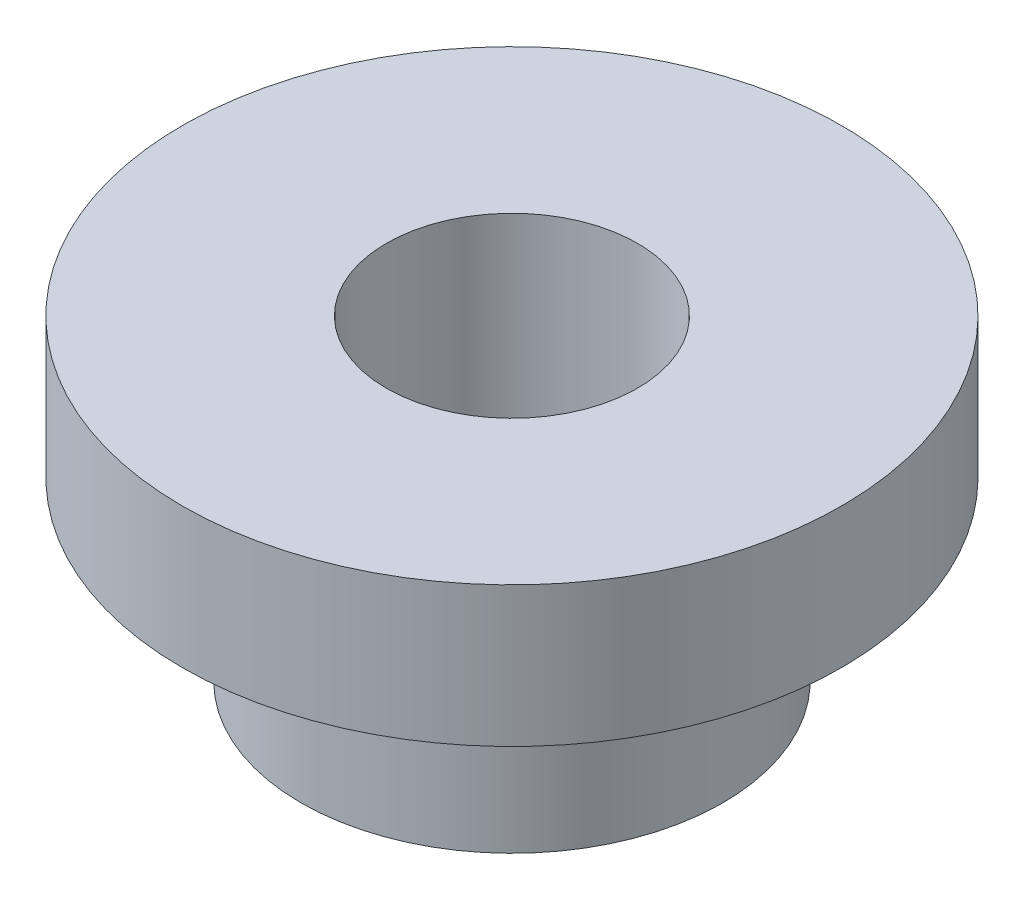
ISO-10303-21;
HEADER;
FILE_DESCRIPTION(('STEP AP214'),'2;1');
FILE_NAME('part.step','',(''),(''),'','','');
FILE_SCHEMA(('AUTOMOTIVE_DESIGN { 1 0 10303 214 1 1 1 1 }'));
ENDSEC;
DATA;
#1=APPLICATION_CONTEXT('core data for automotive mechanical design processes');
#2=APPLICATION_PROTOCOL_DEFINITION('international standard','automotive_design',2000,#1);
#3=PRODUCT_CONTEXT('',#1,'mechanical');
#4=PRODUCT('Part','Part','',(#3));
#5=PRODUCT_RELATED_PRODUCT_CATEGORY('part','',(#4));
#6=PRODUCT_DEFINITION_FORMATION('','',#4);
#7=PRODUCT_DEFINITION_CONTEXT('part definition',#1,'design');
#8=PRODUCT_DEFINITION('design','',#6,#7);
#9=PRODUCT_DEFINITION_SHAPE('','',#8);
#10=(LENGTH_UNIT() NAMED_UNIT(*) SI_UNIT(.MILLI.,.METRE.));
#11=(NAMED_UNIT(*) PLANE_ANGLE_UNIT() SI_UNIT($,.RADIAN.));
#12=(NAMED_UNIT(*) SI_UNIT($,.STERADIAN.) SOLID_ANGLE_UNIT());
#13=UNCERTAINTY_MEASURE_WITH_UNIT(LENGTH_MEASURE(1.E-05),#10,'distance_accuracy_value','');
#14=(GEOMETRIC_REPRESENTATION_CONTEXT(3) GLOBAL_UNCERTAINTY_ASSIGNED_CONTEXT((#13)) GLOBAL_UNIT_ASSIGNED_CONTEXT((#10,
#11,#12)) REPRESENTATION_CONTEXT('',''));
#15=CARTESIAN_POINT('',(0.,0.,0.));
#16=DIRECTION('',(0.,0.,1.));
#17=DIRECTION('',(1.,0.,0.));
#18=AXIS2_PLACEMENT_3D('',#15,#16,#17);
#19=CARTESIAN_POINT('',(8.,-6.,0.));
#20=DIRECTION('',(0.,1.,0.));
#21=DIRECTION('',(0.,0.,1.));
#22=AXIS2_PLACEMENT_3D('',#19,#20,#21);
#23=PLANE('',#22);
#24=CARTESIAN_POINT('',(0.,-6.,0.));
#25=DIRECTION('',(0.,1.,0.));
#26=DIRECTION('',(0.,0.,1.));
#27=AXIS2_PLACEMENT_3D('',#24,#25,#26);
#28=CIRCLE('',#27,8.);
#29=CARTESIAN_POINT('',(0.,-6.,8.));
#30=VERTEX_POINT('',#29);
#31=EDGE_CURVE('E59',#30,#30,#28,.T.);
#32=ORIENTED_EDGE('',*,*,#31,.F.);
#33=EDGE_LOOP('',(#32));
#34=FACE_BOUND('',#33,.T.);
#35=CARTESIAN_POINT('',(0.,-6.,0.));
#36=DIRECTION('',(0.,1.,0.));
#37=DIRECTION('',(0.,0.,1.));
#38=AXIS2_PLACEMENT_3D('',#35,#36,#37);
#39=CIRCLE('',#38,4.7625);
#40=CARTESIAN_POINT('',(0.,-6.,4.7625));
#41=VERTEX_POINT('',#40);
#42=EDGE_CURVE('E10',#41,#41,#39,.T.);
#43=ORIENTED_EDGE('',*,*,#42,.T.);
#44=EDGE_LOOP('',(#43));
#45=FACE_BOUND('',#44,.T.);
#46=ADVANCED_FACE('F37',(#34,#45),#23,.F.);
#47=CARTESIAN_POINT('',(0.,6.,0.));
#48=DIRECTION('',(0.,1.,0.));
#49=DIRECTION('',(0.,0.,1.));
#50=AXIS2_PLACEMENT_3D('',#47,#48,#49);
#51=CYLINDRICAL_SURFACE('',#50,4.7625);
#52=ORIENTED_EDGE('',*,*,#42,.F.);
#53=EDGE_LOOP('',(#52));
#54=FACE_BOUND('',#53,.T.);
#55=CARTESIAN_POINT('',(0.,6.,0.));
#56=DIRECTION('',(0.,1.,0.));
#57=DIRECTION('',(0.,0.,1.));
#58=AXIS2_PLACEMENT_3D('',#55,#56,#57);
#59=CIRCLE('',#58,4.7625);
#60=CARTESIAN_POINT('',(0.,6.,4.7625));
#61=VERTEX_POINT('',#60);
#62=EDGE_CURVE('E43',#61,#61,#59,.T.);
#63=ORIENTED_EDGE('',*,*,#62,.T.);
#64=EDGE_LOOP('',(#63));
#65=FACE_BOUND('',#64,.T.);
#66=ADVANCED_FACE('F66',(#54,#65),#51,.F.);
#67=CARTESIAN_POINT('',(4.7625,6.,0.));
#68=DIRECTION('',(0.,-1.,0.));
#69=DIRECTION('',(0.,0.,-1.));
#70=AXIS2_PLACEMENT_3D('',#67,#68,#69);
#71=PLANE('',#70);
#72=ORIENTED_EDGE('',*,*,#62,.F.);
#73=EDGE_LOOP('',(#72));
#74=FACE_BOUND('',#73,.T.);
#75=CARTESIAN_POINT('',(0.,6.,0.));
#76=DIRECTION('',(0.,1.,0.));
#77=DIRECTION('',(0.,0.,1.));
#78=AXIS2_PLACEMENT_3D('',#75,#76,#77);
#79=CIRCLE('',#78,12.5);
#80=CARTESIAN_POINT('',(0.,6.,12.5));
#81=VERTEX_POINT('',#80);
#82=EDGE_CURVE('E47',#81,#81,#79,.T.);
#83=ORIENTED_EDGE('',*,*,#82,.T.);
#84=EDGE_LOOP('',(#83));
#85=FACE_BOUND('',#84,.T.);
#86=ADVANCED_FACE('F70',(#74,#85),#71,.F.);
#87=CARTESIAN_POINT('',(0.,6.,0.));
#88=DIRECTION('',(0.,1.,0.));
#89=DIRECTION('',(0.,0.,1.));
#90=AXIS2_PLACEMENT_3D('',#87,#88,#89);
#91=CYLINDRICAL_SURFACE('',#90,12.5);
#92=ORIENTED_EDGE('',*,*,#82,.F.);
#93=EDGE_LOOP('',(#92));
#94=FACE_BOUND('',#93,.T.);
#95=CARTESIAN_POINT('',(0.,0.690000000000001,0.));
#96=DIRECTION('',(0.,1.,0.));
#97=DIRECTION('',(0.,0.,1.));
#98=AXIS2_PLACEMENT_3D('',#95,#96,#97);
#99=CIRCLE('',#98,12.5);
#100=CARTESIAN_POINT('',(0.,0.690000000000001,12.5));
#101=VERTEX_POINT('',#100);
#102=EDGE_CURVE('E51',#101,#101,#99,.T.);
#103=ORIENTED_EDGE('',*,*,#102,.T.);
#104=EDGE_LOOP('',(#103));
#105=FACE_BOUND('',#104,.T.);
#106=ADVANCED_FACE('F75',(#94,#105),#91,.T.);
#107=CARTESIAN_POINT('',(12.5,0.69,0.));
#108=DIRECTION('',(0.,1.,0.));
#109=DIRECTION('',(0.,0.,1.));
#110=AXIS2_PLACEMENT_3D('',#107,#108,#109);
#111=PLANE('',#110);
#112=ORIENTED_EDGE('',*,*,#102,.F.);
#113=EDGE_LOOP('',(#112));
#114=FACE_BOUND('',#113,.T.);
#115=CARTESIAN_POINT('',(0.,0.69,0.));
#116=DIRECTION('',(0.,1.,0.));
#117=DIRECTION('',(0.,0.,1.));
#118=AXIS2_PLACEMENT_3D('',#115,#116,#117);
#119=CIRCLE('',#118,8.);
#120=CARTESIAN_POINT('',(0.,0.69,8.));
#121=VERTEX_POINT('',#120);
#122=EDGE_CURVE('E56',#121,#121,#119,.T.);
#123=ORIENTED_EDGE('',*,*,#122,.T.);
#124=EDGE_LOOP('',(#123));
#125=FACE_BOUND('',#124,.T.);
#126=ADVANCED_FACE('F81',(#114,#125),#111,.F.);
#127=CARTESIAN_POINT('',(0.,6.,0.));
#128=DIRECTION('',(0.,1.,0.));
#129=DIRECTION('',(0.,0.,1.));
#130=AXIS2_PLACEMENT_3D('',#127,#128,#129);
#131=CYLINDRICAL_SURFACE('',#130,8.);
#132=ORIENTED_EDGE('',*,*,#122,.F.);
#133=EDGE_LOOP('',(#132));
#134=FACE_BOUND('',#133,.T.);
#135=ORIENTED_EDGE('',*,*,#31,.T.);
#136=EDGE_LOOP('',(#135));
#137=FACE_BOUND('',#136,.T.);
#138=ADVANCED_FACE('F63',(#134,#137),#131,.T.);
#139=CLOSED_SHELL('',(#46,#66,#86,#106,#126,#138));
#140=MANIFOLD_SOLID_BREP('B2',#139);
#141=ADVANCED_BREP_SHAPE_REPRESENTATION('',(#18,#140),#14);
#142=SHAPE_DEFINITION_REPRESENTATION(#9,#141);
ENDSEC;
END-ISO-10303-21;
